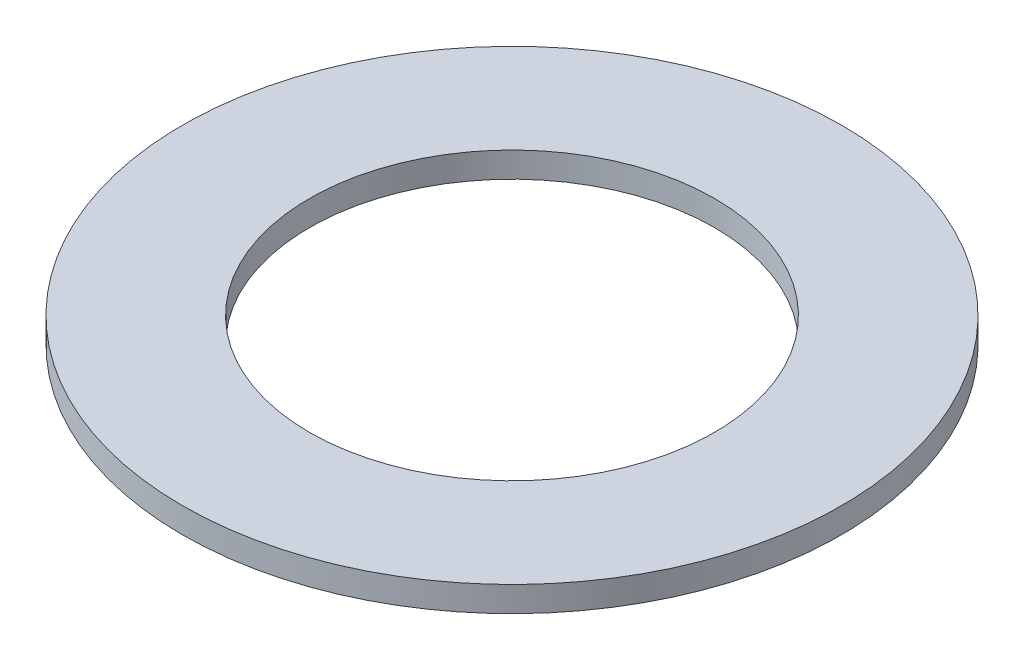
ISO-10303-21;
HEADER;
FILE_DESCRIPTION(('STEP AP214'),'2;1');
FILE_NAME('part.step','',(''),(''),'','','');
FILE_SCHEMA(('AUTOMOTIVE_DESIGN { 1 0 10303 214 1 1 1 1 }'));
ENDSEC;
DATA;
#1=APPLICATION_CONTEXT('core data for automotive mechanical design processes');
#2=APPLICATION_PROTOCOL_DEFINITION('international standard','automotive_design',2000,#1);
#3=PRODUCT_CONTEXT('',#1,'mechanical');
#4=PRODUCT('Part','Part','',(#3));
#5=PRODUCT_RELATED_PRODUCT_CATEGORY('part','',(#4));
#6=PRODUCT_DEFINITION_FORMATION('','',#4);
#7=PRODUCT_DEFINITION_CONTEXT('part definition',#1,'design');
#8=PRODUCT_DEFINITION('design','',#6,#7);
#9=PRODUCT_DEFINITION_SHAPE('','',#8);
#10=(LENGTH_UNIT() NAMED_UNIT(*) SI_UNIT(.MILLI.,.METRE.));
#11=(NAMED_UNIT(*) PLANE_ANGLE_UNIT() SI_UNIT($,.RADIAN.));
#12=(NAMED_UNIT(*) SI_UNIT($,.STERADIAN.) SOLID_ANGLE_UNIT());
#13=UNCERTAINTY_MEASURE_WITH_UNIT(LENGTH_MEASURE(1.E-05),#10,'distance_accuracy_value','');
#14=(GEOMETRIC_REPRESENTATION_CONTEXT(3) GLOBAL_UNCERTAINTY_ASSIGNED_CONTEXT((#13)) GLOBAL_UNIT_ASSIGNED_CONTEXT((#10,
#11,#12)) REPRESENTATION_CONTEXT('',''));
#15=CARTESIAN_POINT('',(0.,0.,0.));
#16=DIRECTION('',(0.,0.,1.));
#17=DIRECTION('',(1.,0.,0.));
#18=AXIS2_PLACEMENT_3D('',#15,#16,#17);
#19=CARTESIAN_POINT('',(0.,0.6,0.));
#20=DIRECTION('',(0.,1.,0.));
#21=DIRECTION('',(0.,0.,1.));
#22=AXIS2_PLACEMENT_3D('',#19,#20,#21);
#23=PLANE('',#22);
#24=CARTESIAN_POINT('',(0.,0.6,0.));
#25=DIRECTION('',(0.,1.,0.));
#26=DIRECTION('',(0.,0.,1.));
#27=AXIS2_PLACEMENT_3D('',#24,#25,#26);
#28=CIRCLE('',#27,7.825);
#29=CARTESIAN_POINT('',(0.,0.6,7.825));
#30=VERTEX_POINT('',#29);
#31=EDGE_CURVE('E10',#30,#30,#28,.T.);
#32=ORIENTED_EDGE('',*,*,#31,.T.);
#33=EDGE_LOOP('',(#32));
#34=FACE_BOUND('',#33,.T.);
#35=CARTESIAN_POINT('',(0.,0.6,0.));
#36=DIRECTION('',(0.,1.,0.));
#37=DIRECTION('',(0.,0.,1.));
#38=AXIS2_PLACEMENT_3D('',#35,#36,#37);
#39=CIRCLE('',#38,4.81);
#40=CARTESIAN_POINT('',(0.,0.6,4.81));
#41=VERTEX_POINT('',#40);
#42=EDGE_CURVE('E42',#41,#41,#39,.T.);
#43=ORIENTED_EDGE('',*,*,#42,.F.);
#44=EDGE_LOOP('',(#43));
#45=FACE_BOUND('',#44,.T.);
#46=ADVANCED_FACE('F31',(#34,#45),#23,.T.);
#47=CARTESIAN_POINT('',(0.,0.,0.));
#48=DIRECTION('',(0.,1.,0.));
#49=DIRECTION('',(0.,0.,1.));
#50=AXIS2_PLACEMENT_3D('',#47,#48,#49);
#51=PLANE('',#50);
#52=CARTESIAN_POINT('',(0.,0.,0.));
#53=DIRECTION('',(0.,1.,0.));
#54=DIRECTION('',(0.,0.,1.));
#55=AXIS2_PLACEMENT_3D('',#52,#53,#54);
#56=CIRCLE('',#55,7.825);
#57=CARTESIAN_POINT('',(0.,0.,7.825));
#58=VERTEX_POINT('',#57);
#59=EDGE_CURVE('E35',#58,#58,#56,.T.);
#60=ORIENTED_EDGE('',*,*,#59,.F.);
#61=EDGE_LOOP('',(#60));
#62=FACE_BOUND('',#61,.T.);
#63=CARTESIAN_POINT('',(0.,0.,0.));
#64=DIRECTION('',(0.,1.,0.));
#65=DIRECTION('',(0.,0.,1.));
#66=AXIS2_PLACEMENT_3D('',#63,#64,#65);
#67=CIRCLE('',#66,4.81);
#68=CARTESIAN_POINT('',(0.,0.,4.81));
#69=VERTEX_POINT('',#68);
#70=EDGE_CURVE('E44',#69,#69,#67,.T.);
#71=ORIENTED_EDGE('',*,*,#70,.T.);
#72=EDGE_LOOP('',(#71));
#73=FACE_BOUND('',#72,.T.);
#74=ADVANCED_FACE('F54',(#62,#73),#51,.F.);
#75=CARTESIAN_POINT('',(0.,0.6,0.));
#76=DIRECTION('',(0.,-1.,0.));
#77=DIRECTION('',(0.,0.,-1.));
#78=AXIS2_PLACEMENT_3D('',#75,#76,#77);
#79=CYLINDRICAL_SURFACE('',#78,7.825);
#80=ORIENTED_EDGE('',*,*,#31,.F.);
#81=EDGE_LOOP('',(#80));
#82=FACE_BOUND('',#81,.T.);
#83=ORIENTED_EDGE('',*,*,#59,.T.);
#84=EDGE_LOOP('',(#83));
#85=FACE_BOUND('',#84,.T.);
#86=ADVANCED_FACE('F33',(#82,#85),#79,.T.);
#87=CARTESIAN_POINT('',(0.,0.6,0.));
#88=DIRECTION('',(0.,-1.,0.));
#89=DIRECTION('',(0.,0.,-1.));
#90=AXIS2_PLACEMENT_3D('',#87,#88,#89);
#91=CYLINDRICAL_SURFACE('',#90,4.81);
#92=ORIENTED_EDGE('',*,*,#42,.T.);
#93=EDGE_LOOP('',(#92));
#94=FACE_BOUND('',#93,.T.);
#95=ORIENTED_EDGE('',*,*,#70,.F.);
#96=EDGE_LOOP('',(#95));
#97=FACE_BOUND('',#96,.T.);
#98=ADVANCED_FACE('F50',(#94,#97),#91,.F.);
#99=CLOSED_SHELL('',(#46,#74,#86,#98));
#100=MANIFOLD_SOLID_BREP('B2',#99);
#101=ADVANCED_BREP_SHAPE_REPRESENTATION('',(#18,#100),#14);
#102=SHAPE_DEFINITION_REPRESENTATION(#9,#101);
ENDSEC;
END-ISO-10303-21;
